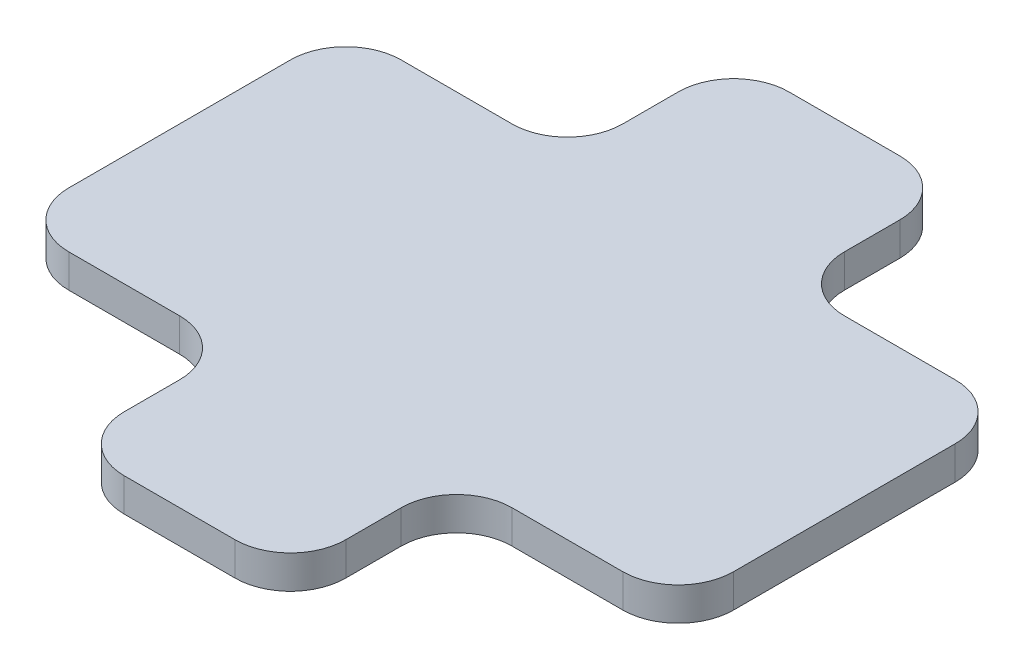
ISO-10303-21;
HEADER;
FILE_DESCRIPTION(('STEP AP214'),'2;1');
FILE_NAME('part.step','',(''),(''),'','','');
FILE_SCHEMA(('AUTOMOTIVE_DESIGN { 1 0 10303 214 1 1 1 1 }'));
ENDSEC;
DATA;
#1=APPLICATION_CONTEXT('core data for automotive mechanical design processes');
#2=APPLICATION_PROTOCOL_DEFINITION('international standard','automotive_design',2000,#1);
#3=PRODUCT_CONTEXT('',#1,'mechanical');
#4=PRODUCT('Part','Part','',(#3));
#5=PRODUCT_RELATED_PRODUCT_CATEGORY('part','',(#4));
#6=PRODUCT_DEFINITION_FORMATION('','',#4);
#7=PRODUCT_DEFINITION_CONTEXT('part definition',#1,'design');
#8=PRODUCT_DEFINITION('design','',#6,#7);
#9=PRODUCT_DEFINITION_SHAPE('','',#8);
#10=(LENGTH_UNIT() NAMED_UNIT(*) SI_UNIT(.MILLI.,.METRE.));
#11=(NAMED_UNIT(*) PLANE_ANGLE_UNIT() SI_UNIT($,.RADIAN.));
#12=(NAMED_UNIT(*) SI_UNIT($,.STERADIAN.) SOLID_ANGLE_UNIT());
#13=UNCERTAINTY_MEASURE_WITH_UNIT(LENGTH_MEASURE(1.E-05),#10,'distance_accuracy_value','');
#14=(GEOMETRIC_REPRESENTATION_CONTEXT(3) GLOBAL_UNCERTAINTY_ASSIGNED_CONTEXT((#13)) GLOBAL_UNIT_ASSIGNED_CONTEXT((#10,
#11,#12)) REPRESENTATION_CONTEXT('',''));
#15=CARTESIAN_POINT('',(0.,0.,0.));
#16=DIRECTION('',(0.,0.,1.));
#17=DIRECTION('',(1.,0.,0.));
#18=AXIS2_PLACEMENT_3D('',#15,#16,#17);
#19=CARTESIAN_POINT('',(10.,3.,15.));
#20=DIRECTION('',(-1.,0.,0.));
#21=DIRECTION('',(0.,0.,1.));
#22=AXIS2_PLACEMENT_3D('',#19,#20,#21);
#23=PLANE('',#22);
#24=DIRECTION('',(0.,0.,-1.));
#25=VECTOR('',#24,1.);
#26=CARTESIAN_POINT('',(10.,3.,15.));
#27=LINE('',#26,#25);
#28=CARTESIAN_POINT('',(10.,3.,25.));
#29=VERTEX_POINT('',#28);
#30=CARTESIAN_POINT('',(10.,3.,20.));
#31=VERTEX_POINT('',#30);
#32=EDGE_CURVE('E241',#29,#31,#27,.T.);
#33=ORIENTED_EDGE('',*,*,#32,.F.);
#34=DIRECTION('',(0.,-1.,0.));
#35=VECTOR('',#34,1.);
#36=CARTESIAN_POINT('',(10.,3.,25.));
#37=LINE('',#36,#35);
#38=CARTESIAN_POINT('',(10.,0.,25.));
#39=VERTEX_POINT('',#38);
#40=EDGE_CURVE('E285',#29,#39,#37,.T.);
#41=ORIENTED_EDGE('',*,*,#40,.T.);
#42=DIRECTION('',(0.,0.,-1.));
#43=VECTOR('',#42,1.);
#44=CARTESIAN_POINT('',(10.,0.,15.));
#45=LINE('',#44,#43);
#46=CARTESIAN_POINT('',(10.,0.,20.));
#47=VERTEX_POINT('',#46);
#48=EDGE_CURVE('E381',#39,#47,#45,.T.);
#49=ORIENTED_EDGE('',*,*,#48,.T.);
#50=DIRECTION('',(0.,-1.,0.));
#51=VECTOR('',#50,1.);
#52=CARTESIAN_POINT('',(10.,3.,20.));
#53=LINE('',#52,#51);
#54=EDGE_CURVE('E283',#47,#31,#53,.F.);
#55=ORIENTED_EDGE('',*,*,#54,.T.);
#56=EDGE_LOOP('',(#33,#41,#49,#55));
#57=FACE_BOUND('',#56,.T.);
#58=ADVANCED_FACE('F41',(#57),#23,.F.);
#59=CARTESIAN_POINT('',(10.,3.,15.));
#60=DIRECTION('',(0.,0.,-1.));
#61=DIRECTION('',(-1.,0.,0.));
#62=AXIS2_PLACEMENT_3D('',#59,#60,#61);
#63=PLANE('',#62);
#64=DIRECTION('',(1.,0.,0.));
#65=VECTOR('',#64,1.);
#66=CARTESIAN_POINT('',(10.,3.,15.));
#67=LINE('',#66,#65);
#68=CARTESIAN_POINT('',(15.,3.,15.));
#69=VERTEX_POINT('',#68);
#70=CARTESIAN_POINT('',(25.,3.,15.));
#71=VERTEX_POINT('',#70);
#72=EDGE_CURVE('E505',#69,#71,#67,.T.);
#73=ORIENTED_EDGE('',*,*,#72,.F.);
#74=DIRECTION('',(0.,-1.,0.));
#75=VECTOR('',#74,1.);
#76=CARTESIAN_POINT('',(15.,0.,15.));
#77=LINE('',#76,#75);
#78=CARTESIAN_POINT('',(15.,0.,15.));
#79=VERTEX_POINT('',#78);
#80=EDGE_CURVE('E290',#69,#79,#77,.T.);
#81=ORIENTED_EDGE('',*,*,#80,.T.);
#82=DIRECTION('',(1.,0.,0.));
#83=VECTOR('',#82,1.);
#84=CARTESIAN_POINT('',(10.,0.,15.));
#85=LINE('',#84,#83);
#86=CARTESIAN_POINT('',(25.,0.,15.));
#87=VERTEX_POINT('',#86);
#88=EDGE_CURVE('E384',#79,#87,#85,.T.);
#89=ORIENTED_EDGE('',*,*,#88,.T.);
#90=DIRECTION('',(0.,-1.,0.));
#91=VECTOR('',#90,1.);
#92=CARTESIAN_POINT('',(25.,3.,15.));
#93=LINE('',#92,#91);
#94=EDGE_CURVE('E288',#87,#71,#93,.F.);
#95=ORIENTED_EDGE('',*,*,#94,.T.);
#96=EDGE_LOOP('',(#73,#81,#89,#95));
#97=FACE_BOUND('',#96,.T.);
#98=ADVANCED_FACE('F420',(#97),#63,.F.);
#99=CARTESIAN_POINT('',(30.,3.,-15.));
#100=DIRECTION('',(-1.,0.,0.));
#101=DIRECTION('',(0.,0.,1.));
#102=AXIS2_PLACEMENT_3D('',#99,#100,#101);
#103=PLANE('',#102);
#104=DIRECTION('',(0.,0.,-1.));
#105=VECTOR('',#104,1.);
#106=CARTESIAN_POINT('',(30.,3.,-15.));
#107=LINE('',#106,#105);
#108=CARTESIAN_POINT('',(30.,3.,10.));
#109=VERTEX_POINT('',#108);
#110=CARTESIAN_POINT('',(30.,3.,-10.));
#111=VERTEX_POINT('',#110);
#112=EDGE_CURVE('E366',#109,#111,#107,.T.);
#113=ORIENTED_EDGE('',*,*,#112,.F.);
#114=DIRECTION('',(0.,-1.,0.));
#115=VECTOR('',#114,1.);
#116=CARTESIAN_POINT('',(30.,3.,10.));
#117=LINE('',#116,#115);
#118=CARTESIAN_POINT('',(30.,0.,10.));
#119=VERTEX_POINT('',#118);
#120=EDGE_CURVE('E295',#109,#119,#117,.T.);
#121=ORIENTED_EDGE('',*,*,#120,.T.);
#122=DIRECTION('',(0.,0.,-1.));
#123=VECTOR('',#122,1.);
#124=CARTESIAN_POINT('',(30.,0.,-15.));
#125=LINE('',#124,#123);
#126=CARTESIAN_POINT('',(30.,0.,-10.));
#127=VERTEX_POINT('',#126);
#128=EDGE_CURVE('E347',#119,#127,#125,.T.);
#129=ORIENTED_EDGE('',*,*,#128,.T.);
#130=DIRECTION('',(0.,-1.,0.));
#131=VECTOR('',#130,1.);
#132=CARTESIAN_POINT('',(30.,3.,-10.));
#133=LINE('',#132,#131);
#134=EDGE_CURVE('E293',#127,#111,#133,.F.);
#135=ORIENTED_EDGE('',*,*,#134,.T.);
#136=EDGE_LOOP('',(#113,#121,#129,#135));
#137=FACE_BOUND('',#136,.T.);
#138=ADVANCED_FACE('F426',(#137),#103,.F.);
#139=CARTESIAN_POINT('',(10.,3.,-15.));
#140=DIRECTION('',(0.,0.,1.));
#141=DIRECTION('',(1.,0.,0.));
#142=AXIS2_PLACEMENT_3D('',#139,#140,#141);
#143=PLANE('',#142);
#144=DIRECTION('',(-1.,0.,0.));
#145=VECTOR('',#144,1.);
#146=CARTESIAN_POINT('',(10.,3.,-15.));
#147=LINE('',#146,#145);
#148=CARTESIAN_POINT('',(25.,3.,-15.));
#149=VERTEX_POINT('',#148);
#150=CARTESIAN_POINT('',(15.,3.,-15.));
#151=VERTEX_POINT('',#150);
#152=EDGE_CURVE('E357',#149,#151,#147,.T.);
#153=ORIENTED_EDGE('',*,*,#152,.F.);
#154=DIRECTION('',(0.,-1.,0.));
#155=VECTOR('',#154,1.);
#156=CARTESIAN_POINT('',(25.,3.,-15.));
#157=LINE('',#156,#155);
#158=CARTESIAN_POINT('',(25.,0.,-15.));
#159=VERTEX_POINT('',#158);
#160=EDGE_CURVE('E300',#149,#159,#157,.T.);
#161=ORIENTED_EDGE('',*,*,#160,.T.);
#162=DIRECTION('',(-1.,0.,0.));
#163=VECTOR('',#162,1.);
#164=CARTESIAN_POINT('',(10.,0.,-15.));
#165=LINE('',#164,#163);
#166=CARTESIAN_POINT('',(15.,0.,-15.));
#167=VERTEX_POINT('',#166);
#168=EDGE_CURVE('E336',#159,#167,#165,.T.);
#169=ORIENTED_EDGE('',*,*,#168,.T.);
#170=DIRECTION('',(0.,-1.,0.));
#171=VECTOR('',#170,1.);
#172=CARTESIAN_POINT('',(15.,3.,-15.));
#173=LINE('',#172,#171);
#174=EDGE_CURVE('E298',#167,#151,#173,.F.);
#175=ORIENTED_EDGE('',*,*,#174,.T.);
#176=EDGE_LOOP('',(#153,#161,#169,#175));
#177=FACE_BOUND('',#176,.T.);
#178=ADVANCED_FACE('F344',(#177),#143,.F.);
#179=CARTESIAN_POINT('',(10.,3.,-30.));
#180=DIRECTION('',(-1.,0.,0.));
#181=DIRECTION('',(0.,0.,1.));
#182=AXIS2_PLACEMENT_3D('',#179,#180,#181);
#183=PLANE('',#182);
#184=DIRECTION('',(0.,0.,-1.));
#185=VECTOR('',#184,1.);
#186=CARTESIAN_POINT('',(10.,3.,-30.));
#187=LINE('',#186,#185);
#188=CARTESIAN_POINT('',(10.,3.,-20.));
#189=VERTEX_POINT('',#188);
#190=CARTESIAN_POINT('',(10.,3.,-25.));
#191=VERTEX_POINT('',#190);
#192=EDGE_CURVE('E355',#189,#191,#187,.T.);
#193=ORIENTED_EDGE('',*,*,#192,.F.);
#194=DIRECTION('',(0.,-1.,0.));
#195=VECTOR('',#194,1.);
#196=CARTESIAN_POINT('',(10.,0.,-20.));
#197=LINE('',#196,#195);
#198=CARTESIAN_POINT('',(10.,0.,-20.));
#199=VERTEX_POINT('',#198);
#200=EDGE_CURVE('E315',#189,#199,#197,.T.);
#201=ORIENTED_EDGE('',*,*,#200,.T.);
#202=DIRECTION('',(0.,0.,-1.));
#203=VECTOR('',#202,1.);
#204=CARTESIAN_POINT('',(10.,0.,-30.));
#205=LINE('',#204,#203);
#206=CARTESIAN_POINT('',(10.,0.,-25.));
#207=VERTEX_POINT('',#206);
#208=EDGE_CURVE('E338',#199,#207,#205,.T.);
#209=ORIENTED_EDGE('',*,*,#208,.T.);
#210=DIRECTION('',(0.,-1.,0.));
#211=VECTOR('',#210,1.);
#212=CARTESIAN_POINT('',(10.,3.,-25.));
#213=LINE('',#212,#211);
#214=EDGE_CURVE('E313',#207,#191,#213,.F.);
#215=ORIENTED_EDGE('',*,*,#214,.T.);
#216=EDGE_LOOP('',(#193,#201,#209,#215));
#217=FACE_BOUND('',#216,.T.);
#218=ADVANCED_FACE('F359',(#217),#183,.F.);
#219=CARTESIAN_POINT('',(-10.,3.,-30.));
#220=DIRECTION('',(0.,0.,1.));
#221=DIRECTION('',(1.,0.,0.));
#222=AXIS2_PLACEMENT_3D('',#219,#220,#221);
#223=PLANE('',#222);
#224=DIRECTION('',(-1.,0.,0.));
#225=VECTOR('',#224,1.);
#226=CARTESIAN_POINT('',(-10.,3.,-30.));
#227=LINE('',#226,#225);
#228=CARTESIAN_POINT('',(5.,3.,-30.));
#229=VERTEX_POINT('',#228);
#230=CARTESIAN_POINT('',(-5.,3.,-30.));
#231=VERTEX_POINT('',#230);
#232=EDGE_CURVE('E361',#229,#231,#227,.T.);
#233=ORIENTED_EDGE('',*,*,#232,.F.);
#234=DIRECTION('',(0.,-1.,0.));
#235=VECTOR('',#234,1.);
#236=CARTESIAN_POINT('',(5.,3.,-30.));
#237=LINE('',#236,#235);
#238=CARTESIAN_POINT('',(5.,0.,-30.));
#239=VERTEX_POINT('',#238);
#240=EDGE_CURVE('E320',#229,#239,#237,.T.);
#241=ORIENTED_EDGE('',*,*,#240,.T.);
#242=DIRECTION('',(-1.,0.,0.));
#243=VECTOR('',#242,1.);
#244=CARTESIAN_POINT('',(-10.,0.,-30.));
#245=LINE('',#244,#243);
#246=CARTESIAN_POINT('',(-5.,0.,-30.));
#247=VERTEX_POINT('',#246);
#248=EDGE_CURVE('E390',#239,#247,#245,.T.);
#249=ORIENTED_EDGE('',*,*,#248,.T.);
#250=DIRECTION('',(0.,-1.,0.));
#251=VECTOR('',#250,1.);
#252=CARTESIAN_POINT('',(-5.,3.,-30.));
#253=LINE('',#252,#251);
#254=EDGE_CURVE('E318',#247,#231,#253,.F.);
#255=ORIENTED_EDGE('',*,*,#254,.T.);
#256=EDGE_LOOP('',(#233,#241,#249,#255));
#257=FACE_BOUND('',#256,.T.);
#258=ADVANCED_FACE('F476',(#257),#223,.F.);
#259=CARTESIAN_POINT('',(-10.,3.,-30.));
#260=DIRECTION('',(1.,0.,0.));
#261=DIRECTION('',(0.,0.,-1.));
#262=AXIS2_PLACEMENT_3D('',#259,#260,#261);
#263=PLANE('',#262);
#264=DIRECTION('',(0.,0.,1.));
#265=VECTOR('',#264,1.);
#266=CARTESIAN_POINT('',(-10.,0.,-30.));
#267=LINE('',#266,#265);
#268=CARTESIAN_POINT('',(-10.,0.,-25.));
#269=VERTEX_POINT('',#268);
#270=CARTESIAN_POINT('',(-10.,0.,-20.));
#271=VERTEX_POINT('',#270);
#272=EDGE_CURVE('E393',#269,#271,#267,.T.);
#273=ORIENTED_EDGE('',*,*,#272,.T.);
#274=DIRECTION('',(0.,-1.,0.));
#275=VECTOR('',#274,1.);
#276=CARTESIAN_POINT('',(-10.,3.,-20.));
#277=LINE('',#276,#275);
#278=CARTESIAN_POINT('',(-10.,3.,-20.));
#279=VERTEX_POINT('',#278);
#280=EDGE_CURVE('E311',#271,#279,#277,.F.);
#281=ORIENTED_EDGE('',*,*,#280,.T.);
#282=DIRECTION('',(0.,0.,1.));
#283=VECTOR('',#282,1.);
#284=CARTESIAN_POINT('',(-10.,3.,-30.));
#285=LINE('',#284,#283);
#286=CARTESIAN_POINT('',(-10.,3.,-25.));
#287=VERTEX_POINT('',#286);
#288=EDGE_CURVE('E364',#287,#279,#285,.T.);
#289=ORIENTED_EDGE('',*,*,#288,.F.);
#290=DIRECTION('',(0.,-1.,0.));
#291=VECTOR('',#290,1.);
#292=CARTESIAN_POINT('',(-10.,3.,-25.));
#293=LINE('',#292,#291);
#294=EDGE_CURVE('E308',#287,#269,#293,.T.);
#295=ORIENTED_EDGE('',*,*,#294,.T.);
#296=EDGE_LOOP('',(#273,#281,#289,#295));
#297=FACE_BOUND('',#296,.T.);
#298=ADVANCED_FACE('F417',(#297),#263,.F.);
#299=CARTESIAN_POINT('',(-30.,3.,-15.));
#300=DIRECTION('',(0.,0.,1.));
#301=DIRECTION('',(1.,0.,0.));
#302=AXIS2_PLACEMENT_3D('',#299,#300,#301);
#303=PLANE('',#302);
#304=DIRECTION('',(-1.,0.,0.));
#305=VECTOR('',#304,1.);
#306=CARTESIAN_POINT('',(-30.,0.,-15.));
#307=LINE('',#306,#305);
#308=CARTESIAN_POINT('',(-15.,0.,-15.));
#309=VERTEX_POINT('',#308);
#310=CARTESIAN_POINT('',(-25.,0.,-15.));
#311=VERTEX_POINT('',#310);
#312=EDGE_CURVE('E236',#309,#311,#307,.T.);
#313=ORIENTED_EDGE('',*,*,#312,.T.);
#314=DIRECTION('',(0.,-1.,0.));
#315=VECTOR('',#314,1.);
#316=CARTESIAN_POINT('',(-25.,3.,-15.));
#317=LINE('',#316,#315);
#318=CARTESIAN_POINT('',(-25.,3.,-15.));
#319=VERTEX_POINT('',#318);
#320=EDGE_CURVE('E306',#311,#319,#317,.F.);
#321=ORIENTED_EDGE('',*,*,#320,.T.);
#322=DIRECTION('',(-1.,0.,0.));
#323=VECTOR('',#322,1.);
#324=CARTESIAN_POINT('',(-30.,3.,-15.));
#325=LINE('',#324,#323);
#326=CARTESIAN_POINT('',(-15.,3.,-15.));
#327=VERTEX_POINT('',#326);
#328=EDGE_CURVE('E372',#327,#319,#325,.T.);
#329=ORIENTED_EDGE('',*,*,#328,.F.);
#330=DIRECTION('',(0.,-1.,0.));
#331=VECTOR('',#330,1.);
#332=CARTESIAN_POINT('',(-15.,0.,-15.));
#333=LINE('',#332,#331);
#334=EDGE_CURVE('E303',#327,#309,#333,.T.);
#335=ORIENTED_EDGE('',*,*,#334,.T.);
#336=EDGE_LOOP('',(#313,#321,#329,#335));
#337=FACE_BOUND('',#336,.T.);
#338=ADVANCED_FACE('F399',(#337),#303,.F.);
#339=CARTESIAN_POINT('',(-30.,3.,-15.));
#340=DIRECTION('',(1.,0.,0.));
#341=DIRECTION('',(0.,0.,-1.));
#342=AXIS2_PLACEMENT_3D('',#339,#340,#341);
#343=PLANE('',#342);
#344=DIRECTION('',(0.,0.,1.));
#345=VECTOR('',#344,1.);
#346=CARTESIAN_POINT('',(-30.,0.,-15.));
#347=LINE('',#346,#345);
#348=CARTESIAN_POINT('',(-30.,0.,-10.));
#349=VERTEX_POINT('',#348);
#350=CARTESIAN_POINT('',(-30.,0.,10.));
#351=VERTEX_POINT('',#350);
#352=EDGE_CURVE('E231',#349,#351,#347,.T.);
#353=ORIENTED_EDGE('',*,*,#352,.T.);
#354=DIRECTION('',(0.,-1.,0.));
#355=VECTOR('',#354,1.);
#356=CARTESIAN_POINT('',(-30.,3.,10.));
#357=LINE('',#356,#355);
#358=CARTESIAN_POINT('',(-30.,3.,10.));
#359=VERTEX_POINT('',#358);
#360=EDGE_CURVE('E208',#351,#359,#357,.F.);
#361=ORIENTED_EDGE('',*,*,#360,.T.);
#362=DIRECTION('',(0.,0.,1.));
#363=VECTOR('',#362,1.);
#364=CARTESIAN_POINT('',(-30.,3.,-15.));
#365=LINE('',#364,#363);
#366=CARTESIAN_POINT('',(-30.,3.,-10.));
#367=VERTEX_POINT('',#366);
#368=EDGE_CURVE('E375',#367,#359,#365,.T.);
#369=ORIENTED_EDGE('',*,*,#368,.F.);
#370=DIRECTION('',(0.,-1.,0.));
#371=VECTOR('',#370,1.);
#372=CARTESIAN_POINT('',(-30.,3.,-10.));
#373=LINE('',#372,#371);
#374=EDGE_CURVE('E213',#367,#349,#373,.T.);
#375=ORIENTED_EDGE('',*,*,#374,.T.);
#376=EDGE_LOOP('',(#353,#361,#369,#375));
#377=FACE_BOUND('',#376,.T.);
#378=ADVANCED_FACE('F408',(#377),#343,.F.);
#379=CARTESIAN_POINT('',(-30.,3.,15.));
#380=DIRECTION('',(0.,0.,-1.));
#381=DIRECTION('',(-1.,0.,0.));
#382=AXIS2_PLACEMENT_3D('',#379,#380,#381);
#383=PLANE('',#382);
#384=DIRECTION('',(1.,0.,0.));
#385=VECTOR('',#384,1.);
#386=CARTESIAN_POINT('',(-30.,3.,15.));
#387=LINE('',#386,#385);
#388=CARTESIAN_POINT('',(-25.,3.,15.));
#389=VERTEX_POINT('',#388);
#390=CARTESIAN_POINT('',(-15.,3.,15.));
#391=VERTEX_POINT('',#390);
#392=EDGE_CURVE('E223',#389,#391,#387,.T.);
#393=ORIENTED_EDGE('',*,*,#392,.F.);
#394=DIRECTION('',(0.,-1.,0.));
#395=VECTOR('',#394,1.);
#396=CARTESIAN_POINT('',(-25.,3.,15.));
#397=LINE('',#396,#395);
#398=CARTESIAN_POINT('',(-25.,0.,15.));
#399=VERTEX_POINT('',#398);
#400=EDGE_CURVE('E207',#389,#399,#397,.T.);
#401=ORIENTED_EDGE('',*,*,#400,.T.);
#402=DIRECTION('',(1.,0.,0.));
#403=VECTOR('',#402,1.);
#404=CARTESIAN_POINT('',(-30.,0.,15.));
#405=LINE('',#404,#403);
#406=CARTESIAN_POINT('',(-15.,0.,15.));
#407=VERTEX_POINT('',#406);
#408=EDGE_CURVE('E220',#399,#407,#405,.T.);
#409=ORIENTED_EDGE('',*,*,#408,.T.);
#410=DIRECTION('',(0.,-1.,0.));
#411=VECTOR('',#410,1.);
#412=CARTESIAN_POINT('',(-15.,3.,15.));
#413=LINE('',#412,#411);
#414=EDGE_CURVE('E225',#407,#391,#413,.F.);
#415=ORIENTED_EDGE('',*,*,#414,.T.);
#416=EDGE_LOOP('',(#393,#401,#409,#415));
#417=FACE_BOUND('',#416,.T.);
#418=ADVANCED_FACE('F219',(#417),#383,.F.);
#419=CARTESIAN_POINT('',(-9.99999999999999,3.,15.));
#420=DIRECTION('',(1.,0.,0.));
#421=DIRECTION('',(0.,0.,-1.));
#422=AXIS2_PLACEMENT_3D('',#419,#420,#421);
#423=PLANE('',#422);
#424=DIRECTION('',(0.,0.,1.));
#425=VECTOR('',#424,1.);
#426=CARTESIAN_POINT('',(-9.99999999999999,3.,15.));
#427=LINE('',#426,#425);
#428=CARTESIAN_POINT('',(-9.99999999999999,3.,20.));
#429=VERTEX_POINT('',#428);
#430=CARTESIAN_POINT('',(-9.99999999999999,3.,25.));
#431=VERTEX_POINT('',#430);
#432=EDGE_CURVE('E378',#429,#431,#427,.T.);
#433=ORIENTED_EDGE('',*,*,#432,.F.);
#434=DIRECTION('',(0.,-1.,0.));
#435=VECTOR('',#434,1.);
#436=CARTESIAN_POINT('',(-9.99999999999999,0.,20.));
#437=LINE('',#436,#435);
#438=CARTESIAN_POINT('',(-9.99999999999999,0.,20.));
#439=VERTEX_POINT('',#438);
#440=EDGE_CURVE('E276',#429,#439,#437,.T.);
#441=ORIENTED_EDGE('',*,*,#440,.T.);
#442=DIRECTION('',(0.,0.,1.));
#443=VECTOR('',#442,1.);
#444=CARTESIAN_POINT('',(-9.99999999999999,0.,15.));
#445=LINE('',#444,#443);
#446=CARTESIAN_POINT('',(-9.99999999999999,0.,25.));
#447=VERTEX_POINT('',#446);
#448=EDGE_CURVE('E230',#439,#447,#445,.T.);
#449=ORIENTED_EDGE('',*,*,#448,.T.);
#450=DIRECTION('',(0.,-1.,0.));
#451=VECTOR('',#450,1.);
#452=CARTESIAN_POINT('',(-9.99999999999999,3.,25.));
#453=LINE('',#452,#451);
#454=EDGE_CURVE('E274',#447,#431,#453,.F.);
#455=ORIENTED_EDGE('',*,*,#454,.T.);
#456=EDGE_LOOP('',(#433,#441,#449,#455));
#457=FACE_BOUND('',#456,.T.);
#458=ADVANCED_FACE('F415',(#457),#423,.F.);
#459=CARTESIAN_POINT('',(-9.99999999999999,3.,30.));
#460=DIRECTION('',(0.,0.,-1.));
#461=DIRECTION('',(-1.,0.,0.));
#462=AXIS2_PLACEMENT_3D('',#459,#460,#461);
#463=PLANE('',#462);
#464=DIRECTION('',(1.,0.,0.));
#465=VECTOR('',#464,1.);
#466=CARTESIAN_POINT('',(-9.99999999999999,3.,30.));
#467=LINE('',#466,#465);
#468=CARTESIAN_POINT('',(-4.99999999999999,3.,30.));
#469=VERTEX_POINT('',#468);
#470=CARTESIAN_POINT('',(5.00000000000001,3.,30.));
#471=VERTEX_POINT('',#470);
#472=EDGE_CURVE('E242',#469,#471,#467,.T.);
#473=ORIENTED_EDGE('',*,*,#472,.F.);
#474=DIRECTION('',(0.,-1.,0.));
#475=VECTOR('',#474,1.);
#476=CARTESIAN_POINT('',(-4.99999999999999,3.,30.));
#477=LINE('',#476,#475);
#478=CARTESIAN_POINT('',(-4.99999999999999,0.,30.));
#479=VERTEX_POINT('',#478);
#480=EDGE_CURVE('E280',#469,#479,#477,.T.);
#481=ORIENTED_EDGE('',*,*,#480,.T.);
#482=DIRECTION('',(1.,0.,0.));
#483=VECTOR('',#482,1.);
#484=CARTESIAN_POINT('',(-9.99999999999999,0.,30.));
#485=LINE('',#484,#483);
#486=CARTESIAN_POINT('',(5.00000000000001,0.,30.));
#487=VERTEX_POINT('',#486);
#488=EDGE_CURVE('E234',#479,#487,#485,.T.);
#489=ORIENTED_EDGE('',*,*,#488,.T.);
#490=DIRECTION('',(0.,-1.,0.));
#491=VECTOR('',#490,1.);
#492=CARTESIAN_POINT('',(5.00000000000001,3.,30.));
#493=LINE('',#492,#491);
#494=EDGE_CURVE('E56',#487,#471,#493,.F.);
#495=ORIENTED_EDGE('',*,*,#494,.T.);
#496=EDGE_LOOP('',(#473,#481,#489,#495));
#497=FACE_BOUND('',#496,.T.);
#498=ADVANCED_FACE('F519',(#497),#463,.F.);
#499=CARTESIAN_POINT('',(0.,3.,0.));
#500=DIRECTION('',(0.,1.,0.));
#501=DIRECTION('',(0.,0.,1.));
#502=AXIS2_PLACEMENT_3D('',#499,#500,#501);
#503=PLANE('',#502);
#504=ORIENTED_EDGE('',*,*,#368,.T.);
#505=CARTESIAN_POINT('',(-25.,3.,10.));
#506=DIRECTION('',(0.,1.,0.));
#507=DIRECTION('',(0.,0.,1.));
#508=AXIS2_PLACEMENT_3D('',#505,#506,#507);
#509=CIRCLE('',#508,5.);
#510=EDGE_CURVE('E272',#359,#389,#509,.T.);
#511=ORIENTED_EDGE('',*,*,#510,.T.);
#512=ORIENTED_EDGE('',*,*,#392,.T.);
#513=CARTESIAN_POINT('',(-15.,3.,20.));
#514=DIRECTION('',(0.,1.,0.));
#515=DIRECTION('',(0.,0.,1.));
#516=AXIS2_PLACEMENT_3D('',#513,#514,#515);
#517=CIRCLE('',#516,5.);
#518=EDGE_CURVE('E324',#391,#429,#517,.F.);
#519=ORIENTED_EDGE('',*,*,#518,.T.);
#520=ORIENTED_EDGE('',*,*,#432,.T.);
#521=CARTESIAN_POINT('',(-4.99999999999999,3.,25.));
#522=DIRECTION('',(0.,1.,0.));
#523=DIRECTION('',(0.,0.,1.));
#524=AXIS2_PLACEMENT_3D('',#521,#522,#523);
#525=CIRCLE('',#524,5.);
#526=EDGE_CURVE('E63',#431,#469,#525,.T.);
#527=ORIENTED_EDGE('',*,*,#526,.T.);
#528=ORIENTED_EDGE('',*,*,#472,.T.);
#529=CARTESIAN_POINT('',(5.00000000000001,3.,25.));
#530=DIRECTION('',(0.,1.,0.));
#531=DIRECTION('',(0.,0.,1.));
#532=AXIS2_PLACEMENT_3D('',#529,#530,#531);
#533=CIRCLE('',#532,5.);
#534=EDGE_CURVE('E269',#471,#29,#533,.T.);
#535=ORIENTED_EDGE('',*,*,#534,.T.);
#536=ORIENTED_EDGE('',*,*,#32,.T.);
#537=CARTESIAN_POINT('',(15.,3.,20.));
#538=DIRECTION('',(0.,1.,0.));
#539=DIRECTION('',(0.,0.,1.));
#540=AXIS2_PLACEMENT_3D('',#537,#538,#539);
#541=CIRCLE('',#540,5.);
#542=EDGE_CURVE('E328',#31,#69,#541,.F.);
#543=ORIENTED_EDGE('',*,*,#542,.T.);
#544=ORIENTED_EDGE('',*,*,#72,.T.);
#545=CARTESIAN_POINT('',(25.,3.,10.));
#546=DIRECTION('',(0.,1.,0.));
#547=DIRECTION('',(0.,0.,1.));
#548=AXIS2_PLACEMENT_3D('',#545,#546,#547);
#549=CIRCLE('',#548,5.);
#550=EDGE_CURVE('E267',#71,#109,#549,.T.);
#551=ORIENTED_EDGE('',*,*,#550,.T.);
#552=ORIENTED_EDGE('',*,*,#112,.T.);
#553=CARTESIAN_POINT('',(25.,3.,-10.));
#554=DIRECTION('',(0.,1.,0.));
#555=DIRECTION('',(0.,0.,1.));
#556=AXIS2_PLACEMENT_3D('',#553,#554,#555);
#557=CIRCLE('',#556,5.);
#558=EDGE_CURVE('E265',#111,#149,#557,.T.);
#559=ORIENTED_EDGE('',*,*,#558,.T.);
#560=ORIENTED_EDGE('',*,*,#152,.T.);
#561=CARTESIAN_POINT('',(15.,3.,-20.));
#562=DIRECTION('',(0.,1.,0.));
#563=DIRECTION('',(0.,0.,1.));
#564=AXIS2_PLACEMENT_3D('',#561,#562,#563);
#565=CIRCLE('',#564,5.);
#566=EDGE_CURVE('E11',#151,#189,#565,.F.);
#567=ORIENTED_EDGE('',*,*,#566,.T.);
#568=ORIENTED_EDGE('',*,*,#192,.T.);
#569=CARTESIAN_POINT('',(5.,3.,-25.));
#570=DIRECTION('',(0.,1.,0.));
#571=DIRECTION('',(0.,0.,1.));
#572=AXIS2_PLACEMENT_3D('',#569,#570,#571);
#573=CIRCLE('',#572,5.);
#574=EDGE_CURVE('E261',#191,#229,#573,.T.);
#575=ORIENTED_EDGE('',*,*,#574,.T.);
#576=ORIENTED_EDGE('',*,*,#232,.T.);
#577=CARTESIAN_POINT('',(-5.,3.,-25.));
#578=DIRECTION('',(0.,1.,0.));
#579=DIRECTION('',(0.,0.,1.));
#580=AXIS2_PLACEMENT_3D('',#577,#578,#579);
#581=CIRCLE('',#580,5.);
#582=EDGE_CURVE('E259',#231,#287,#581,.T.);
#583=ORIENTED_EDGE('',*,*,#582,.T.);
#584=ORIENTED_EDGE('',*,*,#288,.T.);
#585=CARTESIAN_POINT('',(-15.,3.,-20.));
#586=DIRECTION('',(0.,1.,0.));
#587=DIRECTION('',(0.,0.,1.));
#588=AXIS2_PLACEMENT_3D('',#585,#586,#587);
#589=CIRCLE('',#588,5.);
#590=EDGE_CURVE('E332',#279,#327,#589,.F.);
#591=ORIENTED_EDGE('',*,*,#590,.T.);
#592=ORIENTED_EDGE('',*,*,#328,.T.);
#593=CARTESIAN_POINT('',(-25.,3.,-10.));
#594=DIRECTION('',(0.,1.,0.));
#595=DIRECTION('',(0.,0.,1.));
#596=AXIS2_PLACEMENT_3D('',#593,#594,#595);
#597=CIRCLE('',#596,5.);
#598=EDGE_CURVE('E263',#319,#367,#597,.T.);
#599=ORIENTED_EDGE('',*,*,#598,.T.);
#600=EDGE_LOOP('',(#504,#511,#512,#519,#520,#527,#528,#535,#536,#543,#544,#551,#552,#559,#560,
#567,#568,#575,#576,#583,#584,#591,#592,#599));
#601=FACE_BOUND('',#600,.T.);
#602=ADVANCED_FACE('F354',(#601),#503,.T.);
#603=CARTESIAN_POINT('',(0.,0.,0.));
#604=DIRECTION('',(0.,1.,0.));
#605=DIRECTION('',(0.,0.,1.));
#606=AXIS2_PLACEMENT_3D('',#603,#604,#605);
#607=PLANE('',#606);
#608=ORIENTED_EDGE('',*,*,#408,.F.);
#609=CARTESIAN_POINT('',(-25.,0.,10.));
#610=DIRECTION('',(0.,1.,0.));
#611=DIRECTION('',(0.,0.,1.));
#612=AXIS2_PLACEMENT_3D('',#609,#610,#611);
#613=CIRCLE('',#612,5.);
#614=EDGE_CURVE('E203',#399,#351,#613,.F.);
#615=ORIENTED_EDGE('',*,*,#614,.T.);
#616=ORIENTED_EDGE('',*,*,#352,.F.);
#617=CARTESIAN_POINT('',(-25.,0.,-10.));
#618=DIRECTION('',(0.,1.,0.));
#619=DIRECTION('',(0.,0.,1.));
#620=AXIS2_PLACEMENT_3D('',#617,#618,#619);
#621=CIRCLE('',#620,5.);
#622=EDGE_CURVE('E247',#349,#311,#621,.F.);
#623=ORIENTED_EDGE('',*,*,#622,.T.);
#624=ORIENTED_EDGE('',*,*,#312,.F.);
#625=CARTESIAN_POINT('',(-15.,0.,-20.));
#626=DIRECTION('',(0.,1.,0.));
#627=DIRECTION('',(0.,0.,1.));
#628=AXIS2_PLACEMENT_3D('',#625,#626,#627);
#629=CIRCLE('',#628,5.);
#630=EDGE_CURVE('E330',#309,#271,#629,.T.);
#631=ORIENTED_EDGE('',*,*,#630,.T.);
#632=ORIENTED_EDGE('',*,*,#272,.F.);
#633=CARTESIAN_POINT('',(-5.,0.,-25.));
#634=DIRECTION('',(0.,1.,0.));
#635=DIRECTION('',(0.,0.,1.));
#636=AXIS2_PLACEMENT_3D('',#633,#634,#635);
#637=CIRCLE('',#636,5.);
#638=EDGE_CURVE('E224',#269,#247,#637,.F.);
#639=ORIENTED_EDGE('',*,*,#638,.T.);
#640=ORIENTED_EDGE('',*,*,#248,.F.);
#641=CARTESIAN_POINT('',(5.,0.,-25.));
#642=DIRECTION('',(0.,1.,0.));
#643=DIRECTION('',(0.,0.,1.));
#644=AXIS2_PLACEMENT_3D('',#641,#642,#643);
#645=CIRCLE('',#644,5.);
#646=EDGE_CURVE('E245',#239,#207,#645,.F.);
#647=ORIENTED_EDGE('',*,*,#646,.T.);
#648=ORIENTED_EDGE('',*,*,#208,.F.);
#649=CARTESIAN_POINT('',(15.,0.,-20.));
#650=DIRECTION('',(0.,1.,0.));
#651=DIRECTION('',(0.,0.,1.));
#652=AXIS2_PLACEMENT_3D('',#649,#650,#651);
#653=CIRCLE('',#652,5.);
#654=EDGE_CURVE('E49',#199,#167,#653,.T.);
#655=ORIENTED_EDGE('',*,*,#654,.T.);
#656=ORIENTED_EDGE('',*,*,#168,.F.);
#657=CARTESIAN_POINT('',(25.,0.,-10.));
#658=DIRECTION('',(0.,1.,0.));
#659=DIRECTION('',(0.,0.,1.));
#660=AXIS2_PLACEMENT_3D('',#657,#658,#659);
#661=CIRCLE('',#660,5.);
#662=EDGE_CURVE('E249',#159,#127,#661,.F.);
#663=ORIENTED_EDGE('',*,*,#662,.T.);
#664=ORIENTED_EDGE('',*,*,#128,.F.);
#665=CARTESIAN_POINT('',(25.,0.,10.));
#666=DIRECTION('',(0.,1.,0.));
#667=DIRECTION('',(0.,0.,1.));
#668=AXIS2_PLACEMENT_3D('',#665,#666,#667);
#669=CIRCLE('',#668,5.);
#670=EDGE_CURVE('E251',#119,#87,#669,.F.);
#671=ORIENTED_EDGE('',*,*,#670,.T.);
#672=ORIENTED_EDGE('',*,*,#88,.F.);
#673=CARTESIAN_POINT('',(15.,0.,20.));
#674=DIRECTION('',(0.,1.,0.));
#675=DIRECTION('',(0.,0.,1.));
#676=AXIS2_PLACEMENT_3D('',#673,#674,#675);
#677=CIRCLE('',#676,5.);
#678=EDGE_CURVE('E326',#79,#47,#677,.T.);
#679=ORIENTED_EDGE('',*,*,#678,.T.);
#680=ORIENTED_EDGE('',*,*,#48,.F.);
#681=CARTESIAN_POINT('',(5.00000000000001,0.,25.));
#682=DIRECTION('',(0.,1.,0.));
#683=DIRECTION('',(0.,0.,1.));
#684=AXIS2_PLACEMENT_3D('',#681,#682,#683);
#685=CIRCLE('',#684,5.);
#686=EDGE_CURVE('E253',#39,#487,#685,.F.);
#687=ORIENTED_EDGE('',*,*,#686,.T.);
#688=ORIENTED_EDGE('',*,*,#488,.F.);
#689=CARTESIAN_POINT('',(-4.99999999999999,0.,25.));
#690=DIRECTION('',(0.,1.,0.));
#691=DIRECTION('',(0.,0.,1.));
#692=AXIS2_PLACEMENT_3D('',#689,#690,#691);
#693=CIRCLE('',#692,5.);
#694=EDGE_CURVE('E214',#479,#447,#693,.F.);
#695=ORIENTED_EDGE('',*,*,#694,.T.);
#696=ORIENTED_EDGE('',*,*,#448,.F.);
#697=CARTESIAN_POINT('',(-15.,0.,20.));
#698=DIRECTION('',(0.,1.,0.));
#699=DIRECTION('',(0.,0.,1.));
#700=AXIS2_PLACEMENT_3D('',#697,#698,#699);
#701=CIRCLE('',#700,5.);
#702=EDGE_CURVE('E229',#439,#407,#701,.T.);
#703=ORIENTED_EDGE('',*,*,#702,.T.);
#704=EDGE_LOOP('',(#608,#615,#616,#623,#624,#631,#632,#639,#640,#647,#648,#655,#656,#663,#664,
#671,#672,#679,#680,#687,#688,#695,#696,#703));
#705=FACE_BOUND('',#704,.T.);
#706=ADVANCED_FACE('F227',(#705),#607,.F.);
#707=CARTESIAN_POINT('',(-25.,3.,10.));
#708=DIRECTION('',(0.,-1.,0.));
#709=DIRECTION('',(0.,0.,-1.));
#710=AXIS2_PLACEMENT_3D('',#707,#708,#709);
#711=CYLINDRICAL_SURFACE('',#710,5.);
#712=ORIENTED_EDGE('',*,*,#510,.F.);
#713=ORIENTED_EDGE('',*,*,#360,.F.);
#714=ORIENTED_EDGE('',*,*,#614,.F.);
#715=ORIENTED_EDGE('',*,*,#400,.F.);
#716=EDGE_LOOP('',(#712,#713,#714,#715));
#717=FACE_BOUND('',#716,.T.);
#718=ADVANCED_FACE('F206',(#717),#711,.T.);
#719=CARTESIAN_POINT('',(-15.,3.,20.));
#720=DIRECTION('',(0.,1.,0.));
#721=DIRECTION('',(0.,0.,1.));
#722=AXIS2_PLACEMENT_3D('',#719,#720,#721);
#723=CYLINDRICAL_SURFACE('',#722,5.);
#724=ORIENTED_EDGE('',*,*,#518,.F.);
#725=ORIENTED_EDGE('',*,*,#414,.F.);
#726=ORIENTED_EDGE('',*,*,#702,.F.);
#727=ORIENTED_EDGE('',*,*,#440,.F.);
#728=EDGE_LOOP('',(#724,#725,#726,#727));
#729=FACE_BOUND('',#728,.T.);
#730=ADVANCED_FACE('F434',(#729),#723,.F.);
#731=CARTESIAN_POINT('',(-4.99999999999999,3.,25.));
#732=DIRECTION('',(0.,-1.,0.));
#733=DIRECTION('',(0.,0.,-1.));
#734=AXIS2_PLACEMENT_3D('',#731,#732,#733);
#735=CYLINDRICAL_SURFACE('',#734,5.);
#736=ORIENTED_EDGE('',*,*,#526,.F.);
#737=ORIENTED_EDGE('',*,*,#454,.F.);
#738=ORIENTED_EDGE('',*,*,#694,.F.);
#739=ORIENTED_EDGE('',*,*,#480,.F.);
#740=EDGE_LOOP('',(#736,#737,#738,#739));
#741=FACE_BOUND('',#740,.T.);
#742=ADVANCED_FACE('F437',(#741),#735,.T.);
#743=CARTESIAN_POINT('',(5.00000000000001,3.,25.));
#744=DIRECTION('',(0.,-1.,0.));
#745=DIRECTION('',(0.,0.,-1.));
#746=AXIS2_PLACEMENT_3D('',#743,#744,#745);
#747=CYLINDRICAL_SURFACE('',#746,5.);
#748=ORIENTED_EDGE('',*,*,#534,.F.);
#749=ORIENTED_EDGE('',*,*,#494,.F.);
#750=ORIENTED_EDGE('',*,*,#686,.F.);
#751=ORIENTED_EDGE('',*,*,#40,.F.);
#752=EDGE_LOOP('',(#748,#749,#750,#751));
#753=FACE_BOUND('',#752,.T.);
#754=ADVANCED_FACE('F441',(#753),#747,.T.);
#755=CARTESIAN_POINT('',(15.,3.,20.));
#756=DIRECTION('',(0.,1.,0.));
#757=DIRECTION('',(0.,0.,1.));
#758=AXIS2_PLACEMENT_3D('',#755,#756,#757);
#759=CYLINDRICAL_SURFACE('',#758,5.);
#760=ORIENTED_EDGE('',*,*,#542,.F.);
#761=ORIENTED_EDGE('',*,*,#54,.F.);
#762=ORIENTED_EDGE('',*,*,#678,.F.);
#763=ORIENTED_EDGE('',*,*,#80,.F.);
#764=EDGE_LOOP('',(#760,#761,#762,#763));
#765=FACE_BOUND('',#764,.T.);
#766=ADVANCED_FACE('F445',(#765),#759,.F.);
#767=CARTESIAN_POINT('',(25.,3.,10.));
#768=DIRECTION('',(0.,-1.,0.));
#769=DIRECTION('',(0.,0.,-1.));
#770=AXIS2_PLACEMENT_3D('',#767,#768,#769);
#771=CYLINDRICAL_SURFACE('',#770,5.);
#772=ORIENTED_EDGE('',*,*,#550,.F.);
#773=ORIENTED_EDGE('',*,*,#94,.F.);
#774=ORIENTED_EDGE('',*,*,#670,.F.);
#775=ORIENTED_EDGE('',*,*,#120,.F.);
#776=EDGE_LOOP('',(#772,#773,#774,#775));
#777=FACE_BOUND('',#776,.T.);
#778=ADVANCED_FACE('F449',(#777),#771,.T.);
#779=CARTESIAN_POINT('',(25.,3.,-10.));
#780=DIRECTION('',(0.,-1.,0.));
#781=DIRECTION('',(0.,0.,-1.));
#782=AXIS2_PLACEMENT_3D('',#779,#780,#781);
#783=CYLINDRICAL_SURFACE('',#782,5.);
#784=ORIENTED_EDGE('',*,*,#558,.F.);
#785=ORIENTED_EDGE('',*,*,#134,.F.);
#786=ORIENTED_EDGE('',*,*,#662,.F.);
#787=ORIENTED_EDGE('',*,*,#160,.F.);
#788=EDGE_LOOP('',(#784,#785,#786,#787));
#789=FACE_BOUND('',#788,.T.);
#790=ADVANCED_FACE('F453',(#789),#783,.T.);
#791=CARTESIAN_POINT('',(-25.,3.,-10.));
#792=DIRECTION('',(0.,-1.,0.));
#793=DIRECTION('',(0.,0.,-1.));
#794=AXIS2_PLACEMENT_3D('',#791,#792,#793);
#795=CYLINDRICAL_SURFACE('',#794,5.);
#796=ORIENTED_EDGE('',*,*,#598,.F.);
#797=ORIENTED_EDGE('',*,*,#320,.F.);
#798=ORIENTED_EDGE('',*,*,#622,.F.);
#799=ORIENTED_EDGE('',*,*,#374,.F.);
#800=EDGE_LOOP('',(#796,#797,#798,#799));
#801=FACE_BOUND('',#800,.T.);
#802=ADVANCED_FACE('F404',(#801),#795,.T.);
#803=CARTESIAN_POINT('',(-15.,3.,-20.));
#804=DIRECTION('',(0.,1.,0.));
#805=DIRECTION('',(0.,0.,1.));
#806=AXIS2_PLACEMENT_3D('',#803,#804,#805);
#807=CYLINDRICAL_SURFACE('',#806,5.);
#808=ORIENTED_EDGE('',*,*,#590,.F.);
#809=ORIENTED_EDGE('',*,*,#280,.F.);
#810=ORIENTED_EDGE('',*,*,#630,.F.);
#811=ORIENTED_EDGE('',*,*,#334,.F.);
#812=EDGE_LOOP('',(#808,#809,#810,#811));
#813=FACE_BOUND('',#812,.T.);
#814=ADVANCED_FACE('F460',(#813),#807,.F.);
#815=CARTESIAN_POINT('',(15.,3.,-20.));
#816=DIRECTION('',(0.,1.,0.));
#817=DIRECTION('',(0.,0.,1.));
#818=AXIS2_PLACEMENT_3D('',#815,#816,#817);
#819=CYLINDRICAL_SURFACE('',#818,5.);
#820=ORIENTED_EDGE('',*,*,#566,.F.);
#821=ORIENTED_EDGE('',*,*,#174,.F.);
#822=ORIENTED_EDGE('',*,*,#654,.F.);
#823=ORIENTED_EDGE('',*,*,#200,.F.);
#824=EDGE_LOOP('',(#820,#821,#822,#823));
#825=FACE_BOUND('',#824,.T.);
#826=ADVANCED_FACE('F350',(#825),#819,.F.);
#827=CARTESIAN_POINT('',(5.,3.,-25.));
#828=DIRECTION('',(0.,-1.,0.));
#829=DIRECTION('',(0.,0.,-1.));
#830=AXIS2_PLACEMENT_3D('',#827,#828,#829);
#831=CYLINDRICAL_SURFACE('',#830,5.);
#832=ORIENTED_EDGE('',*,*,#574,.F.);
#833=ORIENTED_EDGE('',*,*,#214,.F.);
#834=ORIENTED_EDGE('',*,*,#646,.F.);
#835=ORIENTED_EDGE('',*,*,#240,.F.);
#836=EDGE_LOOP('',(#832,#833,#834,#835));
#837=FACE_BOUND('',#836,.T.);
#838=ADVANCED_FACE('F465',(#837),#831,.T.);
#839=CARTESIAN_POINT('',(-5.,3.,-25.));
#840=DIRECTION('',(0.,-1.,0.));
#841=DIRECTION('',(0.,0.,-1.));
#842=AXIS2_PLACEMENT_3D('',#839,#840,#841);
#843=CYLINDRICAL_SURFACE('',#842,5.);
#844=ORIENTED_EDGE('',*,*,#582,.F.);
#845=ORIENTED_EDGE('',*,*,#254,.F.);
#846=ORIENTED_EDGE('',*,*,#638,.F.);
#847=ORIENTED_EDGE('',*,*,#294,.F.);
#848=EDGE_LOOP('',(#844,#845,#846,#847));
#849=FACE_BOUND('',#848,.T.);
#850=ADVANCED_FACE('F43',(#849),#843,.T.);
#851=CLOSED_SHELL('',(#58,#98,#138,#178,#218,#258,#298,#338,#378,#418,#458,#498,#602,#706,#718,
#730,#742,#754,#766,#778,#790,#802,#814,#826,#838,#850));
#852=MANIFOLD_SOLID_BREP('B2',#851);
#853=ADVANCED_BREP_SHAPE_REPRESENTATION('',(#18,#852),#14);
#854=SHAPE_DEFINITION_REPRESENTATION(#9,#853);
ENDSEC;
END-ISO-10303-21;
